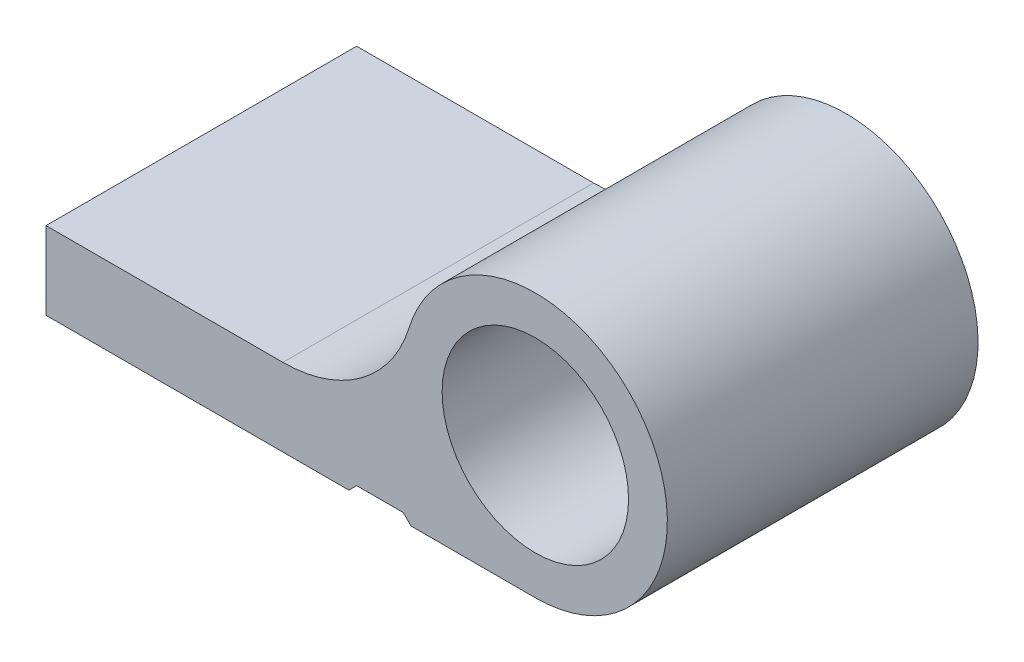
ISO-10303-21;
HEADER;
FILE_DESCRIPTION(('STEP AP214'),'2;1');
FILE_NAME('part.step','',(''),(''),'','','');
FILE_SCHEMA(('AUTOMOTIVE_DESIGN { 1 0 10303 214 1 1 1 1 }'));
ENDSEC;
DATA;
#1=APPLICATION_CONTEXT('core data for automotive mechanical design processes');
#2=APPLICATION_PROTOCOL_DEFINITION('international standard','automotive_design',2000,#1);
#3=PRODUCT_CONTEXT('',#1,'mechanical');
#4=PRODUCT('Part','Part','',(#3));
#5=PRODUCT_RELATED_PRODUCT_CATEGORY('part','',(#4));
#6=PRODUCT_DEFINITION_FORMATION('','',#4);
#7=PRODUCT_DEFINITION_CONTEXT('part definition',#1,'design');
#8=PRODUCT_DEFINITION('design','',#6,#7);
#9=PRODUCT_DEFINITION_SHAPE('','',#8);
#10=(LENGTH_UNIT() NAMED_UNIT(*) SI_UNIT(.MILLI.,.METRE.));
#11=(NAMED_UNIT(*) PLANE_ANGLE_UNIT() SI_UNIT($,.RADIAN.));
#12=(NAMED_UNIT(*) SI_UNIT($,.STERADIAN.) SOLID_ANGLE_UNIT());
#13=UNCERTAINTY_MEASURE_WITH_UNIT(LENGTH_MEASURE(1.E-05),#10,'distance_accuracy_value','');
#14=(GEOMETRIC_REPRESENTATION_CONTEXT(3) GLOBAL_UNCERTAINTY_ASSIGNED_CONTEXT((#13)) GLOBAL_UNIT_ASSIGNED_CONTEXT((#10,
#11,#12)) REPRESENTATION_CONTEXT('',''));
#15=CARTESIAN_POINT('',(0.,0.,0.));
#16=DIRECTION('',(0.,0.,1.));
#17=DIRECTION('',(1.,0.,0.));
#18=AXIS2_PLACEMENT_3D('',#15,#16,#17);
#19=CARTESIAN_POINT('',(0.,0.,20.));
#20=DIRECTION('',(0.,1.,0.));
#21=DIRECTION('',(0.,0.,1.));
#22=AXIS2_PLACEMENT_3D('',#19,#20,#21);
#23=PLANE('',#22);
#24=DIRECTION('',(1.,0.,0.));
#25=VECTOR('',#24,1.);
#26=CARTESIAN_POINT('',(0.,0.,20.));
#27=LINE('',#26,#25);
#28=CARTESIAN_POINT('',(23.5,0.,20.));
#29=VERTEX_POINT('',#28);
#30=CARTESIAN_POINT('',(31.5,0.,20.));
#31=VERTEX_POINT('',#30);
#32=EDGE_CURVE('E129',#29,#31,#27,.T.);
#33=ORIENTED_EDGE('',*,*,#32,.F.);
#34=DIRECTION('',(0.,0.,1.));
#35=VECTOR('',#34,1.);
#36=CARTESIAN_POINT('',(23.5,0.,-80.));
#37=LINE('',#36,#35);
#38=CARTESIAN_POINT('',(23.5,0.,0.));
#39=VERTEX_POINT('',#38);
#40=EDGE_CURVE('E113',#39,#29,#37,.T.);
#41=ORIENTED_EDGE('',*,*,#40,.F.);
#42=DIRECTION('',(1.,0.,0.));
#43=VECTOR('',#42,1.);
#44=CARTESIAN_POINT('',(0.,0.,0.));
#45=LINE('',#44,#43);
#46=CARTESIAN_POINT('',(31.5,0.,0.));
#47=VERTEX_POINT('',#46);
#48=EDGE_CURVE('E167',#39,#47,#45,.T.);
#49=ORIENTED_EDGE('',*,*,#48,.T.);
#50=DIRECTION('',(0.,0.,-1.));
#51=VECTOR('',#50,1.);
#52=CARTESIAN_POINT('',(31.5,0.,20.));
#53=LINE('',#52,#51);
#54=EDGE_CURVE('E138',#31,#47,#53,.T.);
#55=ORIENTED_EDGE('',*,*,#54,.F.);
#56=EDGE_LOOP('',(#33,#41,#49,#55));
#57=FACE_BOUND('',#56,.T.);
#58=ADVANCED_FACE('F40',(#57),#23,.F.);
#59=CARTESIAN_POINT('',(0.,0.,0.));
#60=VERTEX_POINT('',#59);
#61=CARTESIAN_POINT('',(19.5,0.,0.));
#62=VERTEX_POINT('',#61);
#63=EDGE_CURVE('E168',#60,#62,#45,.T.);
#64=ORIENTED_EDGE('',*,*,#63,.T.);
#65=DIRECTION('',(0.,0.,1.));
#66=VECTOR('',#65,1.);
#67=CARTESIAN_POINT('',(19.5,0.,-80.));
#68=LINE('',#67,#66);
#69=CARTESIAN_POINT('',(19.5,0.,20.));
#70=VERTEX_POINT('',#69);
#71=EDGE_CURVE('E134',#62,#70,#68,.T.);
#72=ORIENTED_EDGE('',*,*,#71,.T.);
#73=CARTESIAN_POINT('',(0.,0.,20.));
#74=VERTEX_POINT('',#73);
#75=EDGE_CURVE('E140',#74,#70,#27,.T.);
#76=ORIENTED_EDGE('',*,*,#75,.F.);
#77=DIRECTION('',(0.,0.,-1.));
#78=VECTOR('',#77,1.);
#79=CARTESIAN_POINT('',(0.,0.,20.));
#80=LINE('',#79,#78);
#81=EDGE_CURVE('E179',#74,#60,#80,.T.);
#82=ORIENTED_EDGE('',*,*,#81,.T.);
#83=EDGE_LOOP('',(#64,#72,#76,#82));
#84=FACE_BOUND('',#83,.T.);
#85=ADVANCED_FACE('F230',(#84),#23,.F.);
#86=CARTESIAN_POINT('',(0.,0.,20.));
#87=DIRECTION('',(0.,0.,1.));
#88=DIRECTION('',(1.,0.,0.));
#89=AXIS2_PLACEMENT_3D('',#86,#87,#88);
#90=PLANE('',#89);
#91=DIRECTION('',(-0.707106781186548,0.707106781186547,0.));
#92=VECTOR('',#91,1.);
#93=CARTESIAN_POINT('',(23.,0.5,20.));
#94=LINE('',#93,#92);
#95=CARTESIAN_POINT('',(23.,0.5,20.));
#96=VERTEX_POINT('',#95);
#97=EDGE_CURVE('E116',#29,#96,#94,.T.);
#98=ORIENTED_EDGE('',*,*,#97,.F.);
#99=ORIENTED_EDGE('',*,*,#32,.T.);
#100=CARTESIAN_POINT('',(31.5,8.5,20.));
#101=DIRECTION('',(0.,0.,1.));
#102=DIRECTION('',(1.,0.,0.));
#103=AXIS2_PLACEMENT_3D('',#100,#101,#102);
#104=CIRCLE('',#103,8.5);
#105=CARTESIAN_POINT('',(23.375961595364,11.,20.));
#106=VERTEX_POINT('',#105);
#107=EDGE_CURVE('E176',#106,#31,#104,.F.);
#108=ORIENTED_EDGE('',*,*,#107,.F.);
#109=CARTESIAN_POINT('',(15.2519231907281,13.5,20.));
#110=DIRECTION('',(0.,0.,1.));
#111=DIRECTION('',(1.,0.,0.));
#112=AXIS2_PLACEMENT_3D('',#109,#110,#111);
#113=CIRCLE('',#112,8.5);
#114=CARTESIAN_POINT('',(15.2519231907281,5.,20.));
#115=VERTEX_POINT('',#114);
#116=EDGE_CURVE('E49',#106,#115,#113,.F.);
#117=ORIENTED_EDGE('',*,*,#116,.T.);
#118=DIRECTION('',(-1.,0.,0.));
#119=VECTOR('',#118,1.);
#120=CARTESIAN_POINT('',(0.,5.,20.));
#121=LINE('',#120,#119);
#122=CARTESIAN_POINT('',(0.,5.,20.));
#123=VERTEX_POINT('',#122);
#124=EDGE_CURVE('E148',#115,#123,#121,.T.);
#125=ORIENTED_EDGE('',*,*,#124,.T.);
#126=DIRECTION('',(0.,1.,0.));
#127=VECTOR('',#126,1.);
#128=CARTESIAN_POINT('',(0.,0.,20.));
#129=LINE('',#128,#127);
#130=EDGE_CURVE('E141',#74,#123,#129,.T.);
#131=ORIENTED_EDGE('',*,*,#130,.F.);
#132=ORIENTED_EDGE('',*,*,#75,.T.);
#133=DIRECTION('',(-0.707106781186548,-0.707106781186547,0.));
#134=VECTOR('',#133,1.);
#135=CARTESIAN_POINT('',(19.5,0.,20.));
#136=LINE('',#135,#134);
#137=CARTESIAN_POINT('',(20.,0.5,20.));
#138=VERTEX_POINT('',#137);
#139=EDGE_CURVE('E225',#138,#70,#136,.T.);
#140=ORIENTED_EDGE('',*,*,#139,.F.);
#141=DIRECTION('',(1.,0.,0.));
#142=VECTOR('',#141,1.);
#143=CARTESIAN_POINT('',(0.,0.5,20.));
#144=LINE('',#143,#142);
#145=EDGE_CURVE('E132',#138,#96,#144,.T.);
#146=ORIENTED_EDGE('',*,*,#145,.T.);
#147=EDGE_LOOP('',(#98,#99,#108,#117,#125,#131,#132,#140,#146));
#148=FACE_BOUND('',#147,.T.);
#149=CARTESIAN_POINT('',(31.5,8.5,20.));
#150=DIRECTION('',(0.,0.,1.));
#151=DIRECTION('',(1.,0.,0.));
#152=AXIS2_PLACEMENT_3D('',#149,#150,#151);
#153=CIRCLE('',#152,5.99999999999999);
#154=CARTESIAN_POINT('',(37.5,8.5,20.));
#155=VERTEX_POINT('',#154);
#156=EDGE_CURVE('E146',#155,#155,#153,.T.);
#157=ORIENTED_EDGE('',*,*,#156,.F.);
#158=EDGE_LOOP('',(#157));
#159=FACE_BOUND('',#158,.T.);
#160=ADVANCED_FACE('F127',(#148,#159),#90,.T.);
#161=CARTESIAN_POINT('',(0.,0.,0.));
#162=DIRECTION('',(0.,0.,1.));
#163=DIRECTION('',(1.,0.,0.));
#164=AXIS2_PLACEMENT_3D('',#161,#162,#163);
#165=PLANE('',#164);
#166=CARTESIAN_POINT('',(31.5,8.5,0.));
#167=DIRECTION('',(0.,0.,1.));
#168=DIRECTION('',(1.,0.,0.));
#169=AXIS2_PLACEMENT_3D('',#166,#167,#168);
#170=CIRCLE('',#169,5.99999999999999);
#171=CARTESIAN_POINT('',(37.5,8.5,0.));
#172=VERTEX_POINT('',#171);
#173=EDGE_CURVE('E172',#172,#172,#170,.T.);
#174=ORIENTED_EDGE('',*,*,#173,.T.);
#175=EDGE_LOOP('',(#174));
#176=FACE_BOUND('',#175,.T.);
#177=ORIENTED_EDGE('',*,*,#48,.F.);
#178=DIRECTION('',(-0.707106781186548,0.707106781186547,0.));
#179=VECTOR('',#178,1.);
#180=CARTESIAN_POINT('',(11.75,11.75,0.));
#181=LINE('',#180,#179);
#182=CARTESIAN_POINT('',(23.,0.5,0.));
#183=VERTEX_POINT('',#182);
#184=EDGE_CURVE('E119',#39,#183,#181,.T.);
#185=ORIENTED_EDGE('',*,*,#184,.T.);
#186=DIRECTION('',(1.,0.,0.));
#187=VECTOR('',#186,1.);
#188=CARTESIAN_POINT('',(0.,0.5,0.));
#189=LINE('',#188,#187);
#190=CARTESIAN_POINT('',(20.,0.5,0.));
#191=VERTEX_POINT('',#190);
#192=EDGE_CURVE('E11',#191,#183,#189,.T.);
#193=ORIENTED_EDGE('',*,*,#192,.F.);
#194=DIRECTION('',(-0.707106781186548,-0.707106781186547,0.));
#195=VECTOR('',#194,1.);
#196=CARTESIAN_POINT('',(9.75,-9.75,0.));
#197=LINE('',#196,#195);
#198=EDGE_CURVE('E56',#191,#62,#197,.T.);
#199=ORIENTED_EDGE('',*,*,#198,.T.);
#200=ORIENTED_EDGE('',*,*,#63,.F.);
#201=DIRECTION('',(0.,1.,0.));
#202=VECTOR('',#201,1.);
#203=CARTESIAN_POINT('',(0.,0.,0.));
#204=LINE('',#203,#202);
#205=CARTESIAN_POINT('',(0.,5.,0.));
#206=VERTEX_POINT('',#205);
#207=EDGE_CURVE('E163',#60,#206,#204,.T.);
#208=ORIENTED_EDGE('',*,*,#207,.T.);
#209=DIRECTION('',(-1.,0.,0.));
#210=VECTOR('',#209,1.);
#211=CARTESIAN_POINT('',(0.,5.,0.));
#212=LINE('',#211,#210);
#213=CARTESIAN_POINT('',(15.2519231907281,5.,0.));
#214=VERTEX_POINT('',#213);
#215=EDGE_CURVE('E159',#214,#206,#212,.T.);
#216=ORIENTED_EDGE('',*,*,#215,.F.);
#217=CARTESIAN_POINT('',(15.2519231907281,13.5,0.));
#218=DIRECTION('',(0.,0.,1.));
#219=DIRECTION('',(1.,0.,0.));
#220=AXIS2_PLACEMENT_3D('',#217,#218,#219);
#221=CIRCLE('',#220,8.5);
#222=CARTESIAN_POINT('',(23.375961595364,11.,0.));
#223=VERTEX_POINT('',#222);
#224=EDGE_CURVE('E192',#214,#223,#221,.T.);
#225=ORIENTED_EDGE('',*,*,#224,.T.);
#226=CARTESIAN_POINT('',(31.5,8.5,0.));
#227=DIRECTION('',(0.,0.,1.));
#228=DIRECTION('',(1.,0.,0.));
#229=AXIS2_PLACEMENT_3D('',#226,#227,#228);
#230=CIRCLE('',#229,8.5);
#231=EDGE_CURVE('E155',#223,#47,#230,.F.);
#232=ORIENTED_EDGE('',*,*,#231,.T.);
#233=EDGE_LOOP('',(#177,#185,#193,#199,#200,#208,#216,#225,#232));
#234=FACE_BOUND('',#233,.T.);
#235=ADVANCED_FACE('F206',(#176,#234),#165,.F.);
#236=CARTESIAN_POINT('',(31.5,8.5,20.));
#237=DIRECTION('',(0.,0.,-1.));
#238=DIRECTION('',(-1.,0.,0.));
#239=AXIS2_PLACEMENT_3D('',#236,#237,#238);
#240=CYLINDRICAL_SURFACE('',#239,8.5);
#241=ORIENTED_EDGE('',*,*,#231,.F.);
#242=DIRECTION('',(0.,0.,-1.));
#243=VECTOR('',#242,1.);
#244=CARTESIAN_POINT('',(23.375961595364,11.,20.));
#245=LINE('',#244,#243);
#246=EDGE_CURVE('E64',#223,#106,#245,.F.);
#247=ORIENTED_EDGE('',*,*,#246,.T.);
#248=ORIENTED_EDGE('',*,*,#107,.T.);
#249=ORIENTED_EDGE('',*,*,#54,.T.);
#250=EDGE_LOOP('',(#241,#247,#248,#249));
#251=FACE_BOUND('',#250,.T.);
#252=ADVANCED_FACE('F207',(#251),#240,.T.);
#253=CARTESIAN_POINT('',(0.,5.,20.));
#254=DIRECTION('',(0.,-1.,0.));
#255=DIRECTION('',(0.,0.,-1.));
#256=AXIS2_PLACEMENT_3D('',#253,#254,#255);
#257=PLANE('',#256);
#258=ORIENTED_EDGE('',*,*,#124,.F.);
#259=DIRECTION('',(0.,0.,-1.));
#260=VECTOR('',#259,1.);
#261=CARTESIAN_POINT('',(15.2519231907281,5.,20.));
#262=LINE('',#261,#260);
#263=EDGE_CURVE('E186',#115,#214,#262,.T.);
#264=ORIENTED_EDGE('',*,*,#263,.T.);
#265=ORIENTED_EDGE('',*,*,#215,.T.);
#266=DIRECTION('',(0.,0.,-1.));
#267=VECTOR('',#266,1.);
#268=CARTESIAN_POINT('',(0.,5.,20.));
#269=LINE('',#268,#267);
#270=EDGE_CURVE('E182',#123,#206,#269,.T.);
#271=ORIENTED_EDGE('',*,*,#270,.F.);
#272=EDGE_LOOP('',(#258,#264,#265,#271));
#273=FACE_BOUND('',#272,.T.);
#274=ADVANCED_FACE('F202',(#273),#257,.F.);
#275=CARTESIAN_POINT('',(0.,0.,20.));
#276=DIRECTION('',(-1.,0.,0.));
#277=DIRECTION('',(0.,0.,1.));
#278=AXIS2_PLACEMENT_3D('',#275,#276,#277);
#279=PLANE('',#278);
#280=ORIENTED_EDGE('',*,*,#207,.F.);
#281=ORIENTED_EDGE('',*,*,#81,.F.);
#282=ORIENTED_EDGE('',*,*,#130,.T.);
#283=ORIENTED_EDGE('',*,*,#270,.T.);
#284=EDGE_LOOP('',(#280,#281,#282,#283));
#285=FACE_BOUND('',#284,.T.);
#286=ADVANCED_FACE('F234',(#285),#279,.T.);
#287=CARTESIAN_POINT('',(31.5,8.5,20.));
#288=DIRECTION('',(0.,0.,-1.));
#289=DIRECTION('',(-1.,0.,0.));
#290=AXIS2_PLACEMENT_3D('',#287,#288,#289);
#291=CYLINDRICAL_SURFACE('',#290,5.99999999999999);
#292=ORIENTED_EDGE('',*,*,#156,.T.);
#293=EDGE_LOOP('',(#292));
#294=FACE_BOUND('',#293,.T.);
#295=ORIENTED_EDGE('',*,*,#173,.F.);
#296=EDGE_LOOP('',(#295));
#297=FACE_BOUND('',#296,.T.);
#298=ADVANCED_FACE('F245',(#294,#297),#291,.F.);
#299=CARTESIAN_POINT('',(15.2519231907281,13.5,20.));
#300=DIRECTION('',(0.,0.,-1.));
#301=DIRECTION('',(-1.,0.,0.));
#302=AXIS2_PLACEMENT_3D('',#299,#300,#301);
#303=CYLINDRICAL_SURFACE('',#302,8.5);
#304=ORIENTED_EDGE('',*,*,#116,.F.);
#305=ORIENTED_EDGE('',*,*,#246,.F.);
#306=ORIENTED_EDGE('',*,*,#224,.F.);
#307=ORIENTED_EDGE('',*,*,#263,.F.);
#308=EDGE_LOOP('',(#304,#305,#306,#307));
#309=FACE_BOUND('',#308,.T.);
#310=ADVANCED_FACE('F42',(#309),#303,.F.);
#311=CARTESIAN_POINT('',(0.,0.5,-80.));
#312=DIRECTION('',(0.,-1.,0.));
#313=DIRECTION('',(0.,0.,-1.));
#314=AXIS2_PLACEMENT_3D('',#311,#312,#313);
#315=PLANE('',#314);
#316=ORIENTED_EDGE('',*,*,#192,.T.);
#317=DIRECTION('',(0.,0.,1.));
#318=VECTOR('',#317,1.);
#319=CARTESIAN_POINT('',(23.,0.5,-80.));
#320=LINE('',#319,#318);
#321=EDGE_CURVE('E211',#183,#96,#320,.T.);
#322=ORIENTED_EDGE('',*,*,#321,.T.);
#323=ORIENTED_EDGE('',*,*,#145,.F.);
#324=DIRECTION('',(0.,0.,1.));
#325=VECTOR('',#324,1.);
#326=CARTESIAN_POINT('',(20.,0.5,-80.));
#327=LINE('',#326,#325);
#328=EDGE_CURVE('E160',#191,#138,#327,.T.);
#329=ORIENTED_EDGE('',*,*,#328,.F.);
#330=EDGE_LOOP('',(#316,#322,#323,#329));
#331=FACE_BOUND('',#330,.T.);
#332=ADVANCED_FACE('F237',(#331),#315,.T.);
#333=CARTESIAN_POINT('',(19.5,0.,-80.));
#334=DIRECTION('',(-0.707106781186547,0.707106781186548,0.));
#335=DIRECTION('',(-0.707106781186548,-0.707106781186547,0.));
#336=AXIS2_PLACEMENT_3D('',#333,#334,#335);
#337=PLANE('',#336);
#338=ORIENTED_EDGE('',*,*,#328,.T.);
#339=ORIENTED_EDGE('',*,*,#139,.T.);
#340=ORIENTED_EDGE('',*,*,#71,.F.);
#341=ORIENTED_EDGE('',*,*,#198,.F.);
#342=EDGE_LOOP('',(#338,#339,#340,#341));
#343=FACE_BOUND('',#342,.T.);
#344=ADVANCED_FACE('F227',(#343),#337,.F.);
#345=CARTESIAN_POINT('',(23.,0.5,-80.));
#346=DIRECTION('',(0.707106781186547,0.707106781186548,0.));
#347=DIRECTION('',(-0.707106781186548,0.707106781186547,0.));
#348=AXIS2_PLACEMENT_3D('',#345,#346,#347);
#349=PLANE('',#348);
#350=ORIENTED_EDGE('',*,*,#40,.T.);
#351=ORIENTED_EDGE('',*,*,#97,.T.);
#352=ORIENTED_EDGE('',*,*,#321,.F.);
#353=ORIENTED_EDGE('',*,*,#184,.F.);
#354=EDGE_LOOP('',(#350,#351,#352,#353));
#355=FACE_BOUND('',#354,.T.);
#356=ADVANCED_FACE('F115',(#355),#349,.F.);
#357=CLOSED_SHELL('',(#58,#85,#160,#235,#252,#274,#286,#298,#310,#332,#344,#356));
#358=MANIFOLD_SOLID_BREP('B2',#357);
#359=ADVANCED_BREP_SHAPE_REPRESENTATION('',(#18,#358),#14);
#360=SHAPE_DEFINITION_REPRESENTATION(#9,#359);
ENDSEC;
END-ISO-10303-21;
